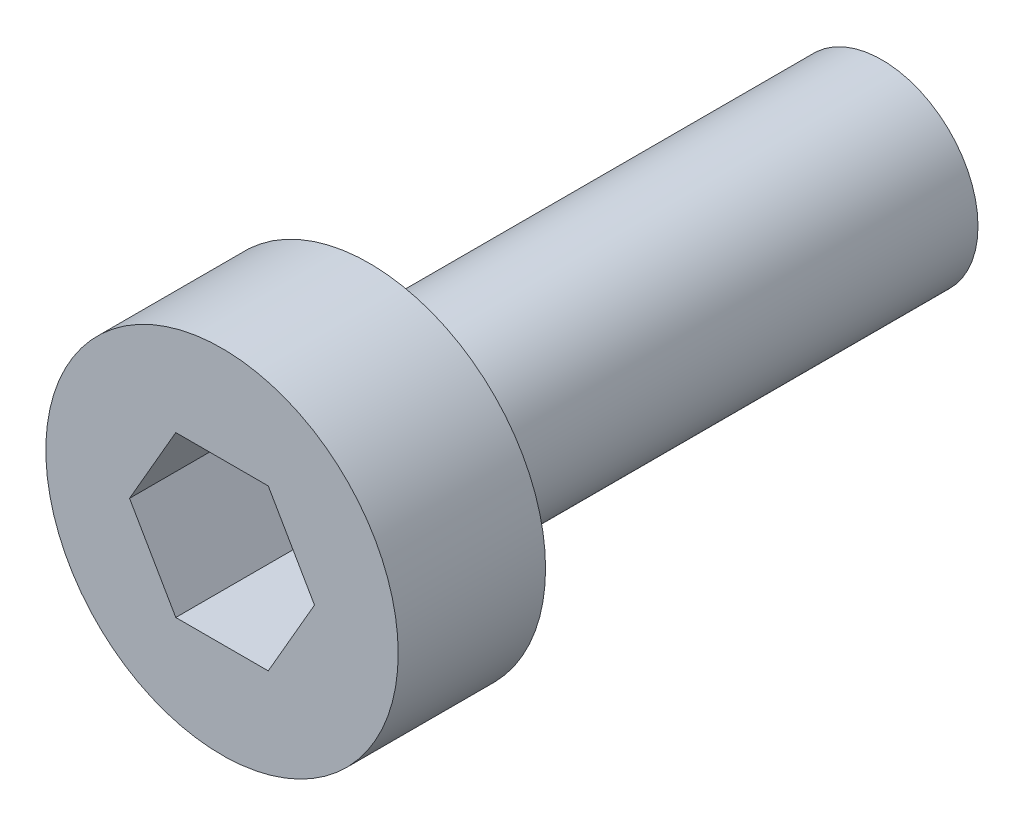
ISO-10303-21;
HEADER;
FILE_DESCRIPTION(('STEP AP214'),'2;1');
FILE_NAME('part.step','',(''),(''),'','','');
FILE_SCHEMA(('AUTOMOTIVE_DESIGN { 1 0 10303 214 1 1 1 1 }'));
ENDSEC;
DATA;
#1=APPLICATION_CONTEXT('core data for automotive mechanical design processes');
#2=APPLICATION_PROTOCOL_DEFINITION('international standard','automotive_design',2000,#1);
#3=PRODUCT_CONTEXT('',#1,'mechanical');
#4=PRODUCT('Part','Part','',(#3));
#5=PRODUCT_RELATED_PRODUCT_CATEGORY('part','',(#4));
#6=PRODUCT_DEFINITION_FORMATION('','',#4);
#7=PRODUCT_DEFINITION_CONTEXT('part definition',#1,'design');
#8=PRODUCT_DEFINITION('design','',#6,#7);
#9=PRODUCT_DEFINITION_SHAPE('','',#8);
#10=(LENGTH_UNIT() NAMED_UNIT(*) SI_UNIT(.MILLI.,.METRE.));
#11=(NAMED_UNIT(*) PLANE_ANGLE_UNIT() SI_UNIT($,.RADIAN.));
#12=(NAMED_UNIT(*) SI_UNIT($,.STERADIAN.) SOLID_ANGLE_UNIT());
#13=UNCERTAINTY_MEASURE_WITH_UNIT(LENGTH_MEASURE(1.E-05),#10,'distance_accuracy_value','');
#14=(GEOMETRIC_REPRESENTATION_CONTEXT(3) GLOBAL_UNCERTAINTY_ASSIGNED_CONTEXT((#13)) GLOBAL_UNIT_ASSIGNED_CONTEXT((#10,
#11,#12)) REPRESENTATION_CONTEXT('',''));
#15=CARTESIAN_POINT('',(0.,0.,0.));
#16=DIRECTION('',(0.,0.,1.));
#17=DIRECTION('',(1.,0.,0.));
#18=AXIS2_PLACEMENT_3D('',#15,#16,#17);
#19=CARTESIAN_POINT('',(0.,0.,8.));
#20=DIRECTION('',(0.,0.,-1.));
#21=DIRECTION('',(-1.,0.,0.));
#22=AXIS2_PLACEMENT_3D('',#19,#20,#21);
#23=CYLINDRICAL_SURFACE('',#22,1.5);
#24=CARTESIAN_POINT('',(0.,0.,8.));
#25=DIRECTION('',(0.,0.,1.));
#26=DIRECTION('',(1.,0.,0.));
#27=AXIS2_PLACEMENT_3D('',#24,#25,#26);
#28=CIRCLE('',#27,1.5);
#29=CARTESIAN_POINT('',(1.5,0.,8.));
#30=VERTEX_POINT('',#29);
#31=EDGE_CURVE('E11',#30,#30,#28,.T.);
#32=ORIENTED_EDGE('',*,*,#31,.F.);
#33=EDGE_LOOP('',(#32));
#34=FACE_BOUND('',#33,.T.);
#35=CARTESIAN_POINT('',(0.,0.,0.));
#36=DIRECTION('',(0.,0.,1.));
#37=DIRECTION('',(1.,0.,0.));
#38=AXIS2_PLACEMENT_3D('',#35,#36,#37);
#39=CIRCLE('',#38,1.5);
#40=CARTESIAN_POINT('',(1.5,0.,0.));
#41=VERTEX_POINT('',#40);
#42=EDGE_CURVE('E37',#41,#41,#39,.T.);
#43=ORIENTED_EDGE('',*,*,#42,.T.);
#44=EDGE_LOOP('',(#43));
#45=FACE_BOUND('',#44,.T.);
#46=ADVANCED_FACE('F34',(#34,#45),#23,.T.);
#47=CARTESIAN_POINT('',(0.,0.,0.));
#48=DIRECTION('',(0.,0.,1.));
#49=DIRECTION('',(1.,0.,0.));
#50=AXIS2_PLACEMENT_3D('',#47,#48,#49);
#51=PLANE('',#50);
#52=ORIENTED_EDGE('',*,*,#42,.F.);
#53=EDGE_LOOP('',(#52));
#54=FACE_BOUND('',#53,.T.);
#55=ADVANCED_FACE('F165',(#54),#51,.F.);
#56=CARTESIAN_POINT('',(0.,0.,10.3));
#57=DIRECTION('',(0.,0.,-1.));
#58=DIRECTION('',(-1.,0.,0.));
#59=AXIS2_PLACEMENT_3D('',#56,#57,#58);
#60=CYLINDRICAL_SURFACE('',#59,2.75);
#61=CARTESIAN_POINT('',(0.,0.,10.3));
#62=DIRECTION('',(0.,0.,1.));
#63=DIRECTION('',(1.,0.,0.));
#64=AXIS2_PLACEMENT_3D('',#61,#62,#63);
#65=CIRCLE('',#64,2.75);
#66=CARTESIAN_POINT('',(2.75,0.,10.3));
#67=VERTEX_POINT('',#66);
#68=EDGE_CURVE('E141',#67,#67,#65,.T.);
#69=ORIENTED_EDGE('',*,*,#68,.F.);
#70=EDGE_LOOP('',(#69));
#71=FACE_BOUND('',#70,.T.);
#72=CARTESIAN_POINT('',(0.,0.,8.));
#73=DIRECTION('',(0.,0.,1.));
#74=DIRECTION('',(1.,0.,0.));
#75=AXIS2_PLACEMENT_3D('',#72,#73,#74);
#76=CIRCLE('',#75,2.75);
#77=CARTESIAN_POINT('',(2.75,0.,8.));
#78=VERTEX_POINT('',#77);
#79=EDGE_CURVE('E135',#78,#78,#76,.T.);
#80=ORIENTED_EDGE('',*,*,#79,.T.);
#81=EDGE_LOOP('',(#80));
#82=FACE_BOUND('',#81,.T.);
#83=ADVANCED_FACE('F147',(#71,#82),#60,.T.);
#84=CARTESIAN_POINT('',(0.,0.,10.3));
#85=DIRECTION('',(0.,0.,1.));
#86=DIRECTION('',(1.,0.,0.));
#87=AXIS2_PLACEMENT_3D('',#84,#85,#86);
#88=PLANE('',#87);
#89=DIRECTION('',(0.5,0.866025403784439,0.));
#90=VECTOR('',#89,1.);
#91=CARTESIAN_POINT('',(0.721687836487032,-1.25,10.3));
#92=LINE('',#91,#90);
#93=CARTESIAN_POINT('',(0.721687836487032,-1.25,10.3));
#94=VERTEX_POINT('',#93);
#95=CARTESIAN_POINT('',(1.44337567297406,0.,10.3));
#96=VERTEX_POINT('',#95);
#97=EDGE_CURVE('E48',#94,#96,#92,.T.);
#98=ORIENTED_EDGE('',*,*,#97,.F.);
#99=DIRECTION('',(1.,0.,0.));
#100=VECTOR('',#99,1.);
#101=CARTESIAN_POINT('',(-0.721687836487033,-1.25,10.3));
#102=LINE('',#101,#100);
#103=CARTESIAN_POINT('',(-0.721687836487033,-1.25,10.3));
#104=VERTEX_POINT('',#103);
#105=EDGE_CURVE('E131',#104,#94,#102,.T.);
#106=ORIENTED_EDGE('',*,*,#105,.F.);
#107=DIRECTION('',(0.5,-0.866025403784439,0.));
#108=VECTOR('',#107,1.);
#109=CARTESIAN_POINT('',(-1.44337567297407,0.,10.3));
#110=LINE('',#109,#108);
#111=CARTESIAN_POINT('',(-1.44337567297407,0.,10.3));
#112=VERTEX_POINT('',#111);
#113=EDGE_CURVE('E129',#112,#104,#110,.T.);
#114=ORIENTED_EDGE('',*,*,#113,.F.);
#115=DIRECTION('',(-0.5,-0.866025403784439,0.));
#116=VECTOR('',#115,1.);
#117=CARTESIAN_POINT('',(-0.721687836487033,1.25,10.3));
#118=LINE('',#117,#116);
#119=CARTESIAN_POINT('',(-0.721687836487033,1.25,10.3));
#120=VERTEX_POINT('',#119);
#121=EDGE_CURVE('E96',#120,#112,#118,.T.);
#122=ORIENTED_EDGE('',*,*,#121,.F.);
#123=DIRECTION('',(-1.,0.,0.));
#124=VECTOR('',#123,1.);
#125=CARTESIAN_POINT('',(0.721687836487032,1.25,10.3));
#126=LINE('',#125,#124);
#127=CARTESIAN_POINT('',(0.721687836487032,1.25,10.3));
#128=VERTEX_POINT('',#127);
#129=EDGE_CURVE('E125',#128,#120,#126,.T.);
#130=ORIENTED_EDGE('',*,*,#129,.F.);
#131=DIRECTION('',(-0.5,0.866025403784439,0.));
#132=VECTOR('',#131,1.);
#133=CARTESIAN_POINT('',(1.44337567297406,0.,10.3));
#134=LINE('',#133,#132);
#135=EDGE_CURVE('E122',#96,#128,#134,.T.);
#136=ORIENTED_EDGE('',*,*,#135,.F.);
#137=EDGE_LOOP('',(#98,#106,#114,#122,#130,#136));
#138=FACE_BOUND('',#137,.T.);
#139=ORIENTED_EDGE('',*,*,#68,.T.);
#140=EDGE_LOOP('',(#139));
#141=FACE_BOUND('',#140,.T.);
#142=ADVANCED_FACE('F152',(#138,#141),#88,.T.);
#143=CARTESIAN_POINT('',(0.,0.,8.));
#144=DIRECTION('',(0.,0.,1.));
#145=DIRECTION('',(1.,0.,0.));
#146=AXIS2_PLACEMENT_3D('',#143,#144,#145);
#147=PLANE('',#146);
#148=ORIENTED_EDGE('',*,*,#31,.T.);
#149=EDGE_LOOP('',(#148));
#150=FACE_BOUND('',#149,.T.);
#151=ORIENTED_EDGE('',*,*,#79,.F.);
#152=EDGE_LOOP('',(#151));
#153=FACE_BOUND('',#152,.T.);
#154=ADVANCED_FACE('F149',(#150,#153),#147,.F.);
#155=CARTESIAN_POINT('',(0.721687836487032,-1.25,8.3));
#156=DIRECTION('',(0.866025403784439,-0.5,0.));
#157=DIRECTION('',(0.5,0.866025403784439,0.));
#158=AXIS2_PLACEMENT_3D('',#155,#156,#157);
#159=PLANE('',#158);
#160=ORIENTED_EDGE('',*,*,#97,.T.);
#161=DIRECTION('',(0.,0.,1.));
#162=VECTOR('',#161,1.);
#163=CARTESIAN_POINT('',(1.44337567297406,0.,8.3));
#164=LINE('',#163,#162);
#165=CARTESIAN_POINT('',(1.44337567297406,0.,8.3));
#166=VERTEX_POINT('',#165);
#167=EDGE_CURVE('E78',#166,#96,#164,.T.);
#168=ORIENTED_EDGE('',*,*,#167,.F.);
#169=DIRECTION('',(0.5,0.866025403784439,0.));
#170=VECTOR('',#169,1.);
#171=CARTESIAN_POINT('',(0.721687836487032,-1.25,8.3));
#172=LINE('',#171,#170);
#173=CARTESIAN_POINT('',(0.721687836487032,-1.25,8.3));
#174=VERTEX_POINT('',#173);
#175=EDGE_CURVE('E133',#174,#166,#172,.T.);
#176=ORIENTED_EDGE('',*,*,#175,.F.);
#177=DIRECTION('',(0.,0.,1.));
#178=VECTOR('',#177,1.);
#179=CARTESIAN_POINT('',(0.721687836487032,-1.25,8.3));
#180=LINE('',#179,#178);
#181=EDGE_CURVE('E56',#174,#94,#180,.T.);
#182=ORIENTED_EDGE('',*,*,#181,.T.);
#183=EDGE_LOOP('',(#160,#168,#176,#182));
#184=FACE_BOUND('',#183,.T.);
#185=ADVANCED_FACE('F151',(#184),#159,.F.);
#186=CARTESIAN_POINT('',(-0.721687836487033,-1.25,8.3));
#187=DIRECTION('',(0.,-1.,0.));
#188=DIRECTION('',(1.,0.,0.));
#189=AXIS2_PLACEMENT_3D('',#186,#187,#188);
#190=PLANE('',#189);
#191=ORIENTED_EDGE('',*,*,#105,.T.);
#192=ORIENTED_EDGE('',*,*,#181,.F.);
#193=DIRECTION('',(1.,0.,0.));
#194=VECTOR('',#193,1.);
#195=CARTESIAN_POINT('',(-0.721687836487033,-1.25,8.3));
#196=LINE('',#195,#194);
#197=CARTESIAN_POINT('',(-0.721687836487033,-1.25,8.3));
#198=VERTEX_POINT('',#197);
#199=EDGE_CURVE('E108',#198,#174,#196,.T.);
#200=ORIENTED_EDGE('',*,*,#199,.F.);
#201=DIRECTION('',(0.,0.,1.));
#202=VECTOR('',#201,1.);
#203=CARTESIAN_POINT('',(-0.721687836487033,-1.25,8.3));
#204=LINE('',#203,#202);
#205=EDGE_CURVE('E100',#198,#104,#204,.T.);
#206=ORIENTED_EDGE('',*,*,#205,.T.);
#207=EDGE_LOOP('',(#191,#192,#200,#206));
#208=FACE_BOUND('',#207,.T.);
#209=ADVANCED_FACE('F159',(#208),#190,.F.);
#210=CARTESIAN_POINT('',(-1.44337567297407,0.,8.3));
#211=DIRECTION('',(-0.866025403784439,-0.5,0.));
#212=DIRECTION('',(0.5,-0.866025403784439,0.));
#213=AXIS2_PLACEMENT_3D('',#210,#211,#212);
#214=PLANE('',#213);
#215=ORIENTED_EDGE('',*,*,#113,.T.);
#216=ORIENTED_EDGE('',*,*,#205,.F.);
#217=DIRECTION('',(0.5,-0.866025403784439,0.));
#218=VECTOR('',#217,1.);
#219=CARTESIAN_POINT('',(-1.44337567297407,0.,8.3));
#220=LINE('',#219,#218);
#221=CARTESIAN_POINT('',(-1.44337567297407,0.,8.3));
#222=VERTEX_POINT('',#221);
#223=EDGE_CURVE('E104',#222,#198,#220,.T.);
#224=ORIENTED_EDGE('',*,*,#223,.F.);
#225=DIRECTION('',(0.,0.,1.));
#226=VECTOR('',#225,1.);
#227=CARTESIAN_POINT('',(-1.44337567297407,0.,8.3));
#228=LINE('',#227,#226);
#229=EDGE_CURVE('E89',#222,#112,#228,.T.);
#230=ORIENTED_EDGE('',*,*,#229,.T.);
#231=EDGE_LOOP('',(#215,#216,#224,#230));
#232=FACE_BOUND('',#231,.T.);
#233=ADVANCED_FACE('F105',(#232),#214,.F.);
#234=CARTESIAN_POINT('',(-0.721687836487033,1.25,8.3));
#235=DIRECTION('',(-0.866025403784439,0.5,0.));
#236=DIRECTION('',(-0.5,-0.866025403784439,0.));
#237=AXIS2_PLACEMENT_3D('',#234,#235,#236);
#238=PLANE('',#237);
#239=ORIENTED_EDGE('',*,*,#121,.T.);
#240=ORIENTED_EDGE('',*,*,#229,.F.);
#241=DIRECTION('',(-0.5,-0.866025403784439,0.));
#242=VECTOR('',#241,1.);
#243=CARTESIAN_POINT('',(-0.721687836487033,1.25,8.3));
#244=LINE('',#243,#242);
#245=CARTESIAN_POINT('',(-0.721687836487033,1.25,8.3));
#246=VERTEX_POINT('',#245);
#247=EDGE_CURVE('E93',#246,#222,#244,.T.);
#248=ORIENTED_EDGE('',*,*,#247,.F.);
#249=DIRECTION('',(0.,0.,1.));
#250=VECTOR('',#249,1.);
#251=CARTESIAN_POINT('',(-0.721687836487033,1.25,8.3));
#252=LINE('',#251,#250);
#253=EDGE_CURVE('E101',#246,#120,#252,.T.);
#254=ORIENTED_EDGE('',*,*,#253,.T.);
#255=EDGE_LOOP('',(#239,#240,#248,#254));
#256=FACE_BOUND('',#255,.T.);
#257=ADVANCED_FACE('F91',(#256),#238,.F.);
#258=CARTESIAN_POINT('',(0.721687836487032,1.25,8.3));
#259=DIRECTION('',(0.,1.,0.));
#260=DIRECTION('',(0.,0.,1.));
#261=AXIS2_PLACEMENT_3D('',#258,#259,#260);
#262=PLANE('',#261);
#263=ORIENTED_EDGE('',*,*,#129,.T.);
#264=ORIENTED_EDGE('',*,*,#253,.F.);
#265=DIRECTION('',(-1.,0.,0.));
#266=VECTOR('',#265,1.);
#267=CARTESIAN_POINT('',(0.721687836487032,1.25,8.3));
#268=LINE('',#267,#266);
#269=CARTESIAN_POINT('',(0.721687836487032,1.25,8.3));
#270=VERTEX_POINT('',#269);
#271=EDGE_CURVE('E114',#270,#246,#268,.T.);
#272=ORIENTED_EDGE('',*,*,#271,.F.);
#273=DIRECTION('',(0.,0.,1.));
#274=VECTOR('',#273,1.);
#275=CARTESIAN_POINT('',(0.721687836487032,1.25,8.3));
#276=LINE('',#275,#274);
#277=EDGE_CURVE('E138',#270,#128,#276,.T.);
#278=ORIENTED_EDGE('',*,*,#277,.T.);
#279=EDGE_LOOP('',(#263,#264,#272,#278));
#280=FACE_BOUND('',#279,.T.);
#281=ADVANCED_FACE('F220',(#280),#262,.F.);
#282=CARTESIAN_POINT('',(1.44337567297406,0.,8.3));
#283=DIRECTION('',(0.866025403784439,0.5,0.));
#284=DIRECTION('',(-0.5,0.866025403784439,0.));
#285=AXIS2_PLACEMENT_3D('',#282,#283,#284);
#286=PLANE('',#285);
#287=ORIENTED_EDGE('',*,*,#135,.T.);
#288=ORIENTED_EDGE('',*,*,#277,.F.);
#289=DIRECTION('',(-0.5,0.866025403784439,0.));
#290=VECTOR('',#289,1.);
#291=CARTESIAN_POINT('',(1.44337567297406,0.,8.3));
#292=LINE('',#291,#290);
#293=EDGE_CURVE('E116',#166,#270,#292,.T.);
#294=ORIENTED_EDGE('',*,*,#293,.F.);
#295=ORIENTED_EDGE('',*,*,#167,.T.);
#296=EDGE_LOOP('',(#287,#288,#294,#295));
#297=FACE_BOUND('',#296,.T.);
#298=ADVANCED_FACE('F229',(#297),#286,.F.);
#299=CARTESIAN_POINT('',(0.,0.,8.3));
#300=DIRECTION('',(0.,0.,1.));
#301=DIRECTION('',(1.,0.,0.));
#302=AXIS2_PLACEMENT_3D('',#299,#300,#301);
#303=PLANE('',#302);
#304=ORIENTED_EDGE('',*,*,#175,.T.);
#305=ORIENTED_EDGE('',*,*,#293,.T.);
#306=ORIENTED_EDGE('',*,*,#271,.T.);
#307=ORIENTED_EDGE('',*,*,#247,.T.);
#308=ORIENTED_EDGE('',*,*,#223,.T.);
#309=ORIENTED_EDGE('',*,*,#199,.T.);
#310=EDGE_LOOP('',(#304,#305,#306,#307,#308,#309));
#311=FACE_BOUND('',#310,.T.);
#312=ADVANCED_FACE('F111',(#311),#303,.T.);
#313=CLOSED_SHELL('',(#46,#55,#83,#142,#154,#185,#209,#233,#257,#281,#298,#312));
#314=MANIFOLD_SOLID_BREP('B2',#313);
#315=ADVANCED_BREP_SHAPE_REPRESENTATION('',(#18,#314),#14);
#316=SHAPE_DEFINITION_REPRESENTATION(#9,#315);
ENDSEC;
END-ISO-10303-21;
